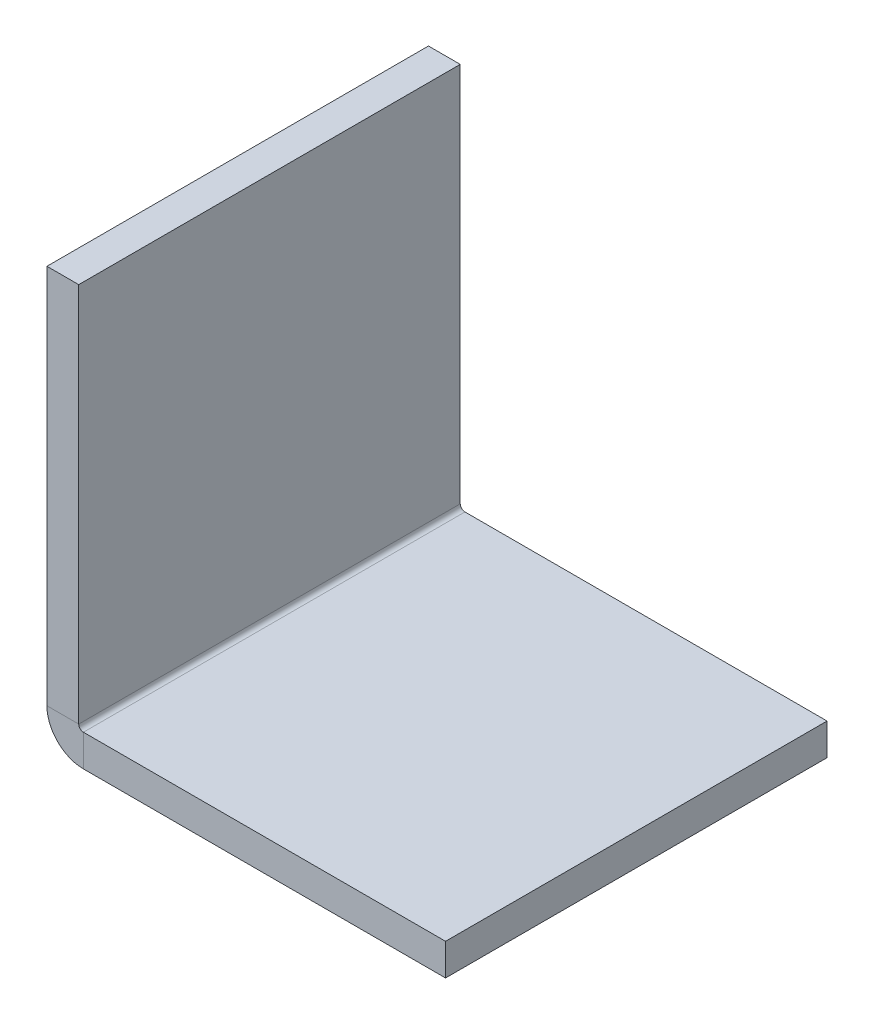
ISO-10303-21;
HEADER;
FILE_DESCRIPTION(('STEP AP214'),'2;1');
FILE_NAME('part.step','',(''),(''),'','','');
FILE_SCHEMA(('AUTOMOTIVE_DESIGN { 1 0 10303 214 1 1 1 1 }'));
ENDSEC;
DATA;
#1=APPLICATION_CONTEXT('core data for automotive mechanical design processes');
#2=APPLICATION_PROTOCOL_DEFINITION('international standard','automotive_design',2000,#1);
#3=PRODUCT_CONTEXT('',#1,'mechanical');
#4=PRODUCT('Part','Part','',(#3));
#5=PRODUCT_RELATED_PRODUCT_CATEGORY('part','',(#4));
#6=PRODUCT_DEFINITION_FORMATION('','',#4);
#7=PRODUCT_DEFINITION_CONTEXT('part definition',#1,'design');
#8=PRODUCT_DEFINITION('design','',#6,#7);
#9=PRODUCT_DEFINITION_SHAPE('','',#8);
#10=(LENGTH_UNIT() NAMED_UNIT(*) SI_UNIT(.MILLI.,.METRE.));
#11=(NAMED_UNIT(*) PLANE_ANGLE_UNIT() SI_UNIT($,.RADIAN.));
#12=(NAMED_UNIT(*) SI_UNIT($,.STERADIAN.) SOLID_ANGLE_UNIT());
#13=UNCERTAINTY_MEASURE_WITH_UNIT(LENGTH_MEASURE(1.E-05),#10,'distance_accuracy_value','');
#14=(GEOMETRIC_REPRESENTATION_CONTEXT(3) GLOBAL_UNCERTAINTY_ASSIGNED_CONTEXT((#13)) GLOBAL_UNIT_ASSIGNED_CONTEXT((#10,
#11,#12)) REPRESENTATION_CONTEXT('',''));
#15=CARTESIAN_POINT('',(0.,0.,0.));
#16=DIRECTION('',(0.,0.,1.));
#17=DIRECTION('',(1.,0.,0.));
#18=AXIS2_PLACEMENT_3D('',#15,#16,#17);
#19=CARTESIAN_POINT('',(-28.1077134113646,-30.2955996207415,30.));
#20=DIRECTION('',(0.,0.,1.));
#21=DIRECTION('',(1.,0.,0.));
#22=AXIS2_PLACEMENT_3D('',#19,#20,#21);
#23=PLANE('',#22);
#24=DIRECTION('',(0.,-1.,0.));
#25=VECTOR('',#24,1.);
#26=CARTESIAN_POINT('',(-28.1077134113646,-30.2955996207415,30.));
#27=LINE('',#26,#25);
#28=CARTESIAN_POINT('',(-28.1077134113646,-30.2955996207415,30.));
#29=VERTEX_POINT('',#28);
#30=CARTESIAN_POINT('',(-28.1077134113646,-35.2955996207415,30.));
#31=VERTEX_POINT('',#30);
#32=EDGE_CURVE('E11',#29,#31,#27,.T.);
#33=ORIENTED_EDGE('',*,*,#32,.F.);
#34=CARTESIAN_POINT('',(-28.1077134113647,-29.5589996207415,30.));
#35=DIRECTION('',(0.,0.,1.));
#36=DIRECTION('',(1.,0.,0.));
#37=AXIS2_PLACEMENT_3D('',#34,#35,#36);
#38=CIRCLE('',#37,0.7366);
#39=CARTESIAN_POINT('',(-28.8443134113647,-29.5589996207415,30.));
#40=VERTEX_POINT('',#39);
#41=EDGE_CURVE('E140',#40,#29,#38,.T.);
#42=ORIENTED_EDGE('',*,*,#41,.F.);
#43=DIRECTION('',(1.,0.,0.));
#44=VECTOR('',#43,1.);
#45=CARTESIAN_POINT('',(-33.8443134113647,-29.5589996207415,30.));
#46=LINE('',#45,#44);
#47=CARTESIAN_POINT('',(-33.8443134113647,-29.5589996207415,30.));
#48=VERTEX_POINT('',#47);
#49=EDGE_CURVE('E51',#48,#40,#46,.T.);
#50=ORIENTED_EDGE('',*,*,#49,.F.);
#51=CARTESIAN_POINT('',(-28.1077134113647,-29.5589996207415,30.));
#52=DIRECTION('',(0.,0.,1.));
#53=DIRECTION('',(1.,0.,0.));
#54=AXIS2_PLACEMENT_3D('',#51,#52,#53);
#55=CIRCLE('',#54,5.7366);
#56=EDGE_CURVE('E133',#48,#31,#55,.T.);
#57=ORIENTED_EDGE('',*,*,#56,.T.);
#58=EDGE_LOOP('',(#33,#42,#50,#57));
#59=FACE_BOUND('',#58,.T.);
#60=ADVANCED_FACE('F43',(#59),#23,.T.);
#61=CARTESIAN_POINT('',(-33.8443134113647,-29.5589996207415,30.));
#62=DIRECTION('',(0.,0.,1.));
#63=DIRECTION('',(1.,0.,0.));
#64=AXIS2_PLACEMENT_3D('',#61,#62,#63);
#65=PLANE('',#64);
#66=DIRECTION('',(1.,0.,0.));
#67=VECTOR('',#66,1.);
#68=CARTESIAN_POINT('',(28.8443134113647,-30.2955996207415,30.));
#69=LINE('',#68,#67);
#70=CARTESIAN_POINT('',(28.8443134113647,-30.2955996207415,30.));
#71=VERTEX_POINT('',#70);
#72=EDGE_CURVE('E189',#29,#71,#69,.T.);
#73=ORIENTED_EDGE('',*,*,#72,.F.);
#74=ORIENTED_EDGE('',*,*,#32,.T.);
#75=DIRECTION('',(1.,0.,0.));
#76=VECTOR('',#75,1.);
#77=CARTESIAN_POINT('',(28.8443134113647,-35.2955996207415,30.));
#78=LINE('',#77,#76);
#79=CARTESIAN_POINT('',(28.8443134113647,-35.2955996207415,30.));
#80=VERTEX_POINT('',#79);
#81=EDGE_CURVE('E99',#31,#80,#78,.T.);
#82=ORIENTED_EDGE('',*,*,#81,.T.);
#83=DIRECTION('',(0.,-1.,0.));
#84=VECTOR('',#83,1.);
#85=CARTESIAN_POINT('',(28.8443134113647,-30.2955996207415,30.));
#86=LINE('',#85,#84);
#87=EDGE_CURVE('E346',#71,#80,#86,.T.);
#88=ORIENTED_EDGE('',*,*,#87,.F.);
#89=EDGE_LOOP('',(#73,#74,#82,#88));
#90=FACE_BOUND('',#89,.T.);
#91=ADVANCED_FACE('F197',(#90),#65,.T.);
#92=CARTESIAN_POINT('',(-28.8443134113647,-29.5589996207415,-30.));
#93=DIRECTION('',(0.,0.,-1.));
#94=DIRECTION('',(-1.,0.,0.));
#95=AXIS2_PLACEMENT_3D('',#92,#93,#94);
#96=PLANE('',#95);
#97=DIRECTION('',(-1.,0.,0.));
#98=VECTOR('',#97,1.);
#99=CARTESIAN_POINT('',(-28.8443134113647,-29.5589996207415,-30.));
#100=LINE('',#99,#98);
#101=CARTESIAN_POINT('',(-28.8443134113647,-29.5589996207415,-30.));
#102=VERTEX_POINT('',#101);
#103=CARTESIAN_POINT('',(-33.8443134113647,-29.5589996207415,-30.));
#104=VERTEX_POINT('',#103);
#105=EDGE_CURVE('E86',#102,#104,#100,.T.);
#106=ORIENTED_EDGE('',*,*,#105,.F.);
#107=CARTESIAN_POINT('',(-28.1077134113647,-29.5589996207415,-30.));
#108=DIRECTION('',(0.,0.,1.));
#109=DIRECTION('',(1.,0.,0.));
#110=AXIS2_PLACEMENT_3D('',#107,#108,#109);
#111=CIRCLE('',#110,0.7366);
#112=CARTESIAN_POINT('',(-28.1077134113646,-30.2955996207415,-30.));
#113=VERTEX_POINT('',#112);
#114=EDGE_CURVE('E155',#102,#113,#111,.T.);
#115=ORIENTED_EDGE('',*,*,#114,.T.);
#116=DIRECTION('',(0.,1.,0.));
#117=VECTOR('',#116,1.);
#118=CARTESIAN_POINT('',(-28.1077134113646,-35.2955996207415,-30.));
#119=LINE('',#118,#117);
#120=CARTESIAN_POINT('',(-28.1077134113646,-35.2955996207415,-30.));
#121=VERTEX_POINT('',#120);
#122=EDGE_CURVE('E93',#121,#113,#119,.T.);
#123=ORIENTED_EDGE('',*,*,#122,.F.);
#124=CARTESIAN_POINT('',(-28.1077134113647,-29.5589996207415,-30.));
#125=DIRECTION('',(0.,0.,1.));
#126=DIRECTION('',(1.,0.,0.));
#127=AXIS2_PLACEMENT_3D('',#124,#125,#126);
#128=CIRCLE('',#127,5.7366);
#129=EDGE_CURVE('E162',#104,#121,#128,.T.);
#130=ORIENTED_EDGE('',*,*,#129,.F.);
#131=EDGE_LOOP('',(#106,#115,#123,#130));
#132=FACE_BOUND('',#131,.T.);
#133=ADVANCED_FACE('F195',(#132),#96,.T.);
#134=CARTESIAN_POINT('',(-28.1077134113646,-35.2955996207415,-30.));
#135=DIRECTION('',(0.,0.,-1.));
#136=DIRECTION('',(-1.,0.,0.));
#137=AXIS2_PLACEMENT_3D('',#134,#135,#136);
#138=PLANE('',#137);
#139=DIRECTION('',(0.,-1.,0.));
#140=VECTOR('',#139,1.);
#141=CARTESIAN_POINT('',(-28.8443134113647,30.2955996207415,-30.));
#142=LINE('',#141,#140);
#143=CARTESIAN_POINT('',(-28.8443134113647,30.2955996207415,-30.));
#144=VERTEX_POINT('',#143);
#145=EDGE_CURVE('E157',#144,#102,#142,.T.);
#146=ORIENTED_EDGE('',*,*,#145,.T.);
#147=ORIENTED_EDGE('',*,*,#105,.T.);
#148=DIRECTION('',(0.,1.,0.));
#149=VECTOR('',#148,1.);
#150=CARTESIAN_POINT('',(-33.8443134113647,30.2955996207415,-30.));
#151=LINE('',#150,#149);
#152=CARTESIAN_POINT('',(-33.8443134113647,30.2955996207415,-30.));
#153=VERTEX_POINT('',#152);
#154=EDGE_CURVE('E160',#153,#104,#151,.F.);
#155=ORIENTED_EDGE('',*,*,#154,.F.);
#156=DIRECTION('',(1.,0.,0.));
#157=VECTOR('',#156,1.);
#158=CARTESIAN_POINT('',(-33.8443134113647,30.2955996207415,-30.));
#159=LINE('',#158,#157);
#160=EDGE_CURVE('E121',#153,#144,#159,.T.);
#161=ORIENTED_EDGE('',*,*,#160,.T.);
#162=EDGE_LOOP('',(#146,#147,#155,#161));
#163=FACE_BOUND('',#162,.T.);
#164=ADVANCED_FACE('F191',(#163),#138,.T.);
#165=CARTESIAN_POINT('',(28.8443134113647,-35.2955996207415,30.));
#166=DIRECTION('',(0.,1.,0.));
#167=DIRECTION('',(0.,0.,1.));
#168=AXIS2_PLACEMENT_3D('',#165,#166,#167);
#169=PLANE('',#168);
#170=DIRECTION('',(1.,0.,0.));
#171=VECTOR('',#170,1.);
#172=CARTESIAN_POINT('',(28.8443134113647,-35.2955996207415,-30.));
#173=LINE('',#172,#171);
#174=CARTESIAN_POINT('',(28.8443134113647,-35.2955996207415,-30.));
#175=VERTEX_POINT('',#174);
#176=EDGE_CURVE('E146',#121,#175,#173,.T.);
#177=ORIENTED_EDGE('',*,*,#176,.T.);
#178=DIRECTION('',(0.,0.,-1.));
#179=VECTOR('',#178,1.);
#180=CARTESIAN_POINT('',(28.8443134113647,-35.2955996207415,30.));
#181=LINE('',#180,#179);
#182=EDGE_CURVE('E176',#80,#175,#181,.T.);
#183=ORIENTED_EDGE('',*,*,#182,.F.);
#184=ORIENTED_EDGE('',*,*,#81,.F.);
#185=DIRECTION('',(0.,0.,-1.));
#186=VECTOR('',#185,1.);
#187=CARTESIAN_POINT('',(-28.1077134113646,-35.2955996207415,30.));
#188=LINE('',#187,#186);
#189=EDGE_CURVE('E145',#31,#121,#188,.T.);
#190=ORIENTED_EDGE('',*,*,#189,.T.);
#191=EDGE_LOOP('',(#177,#183,#184,#190));
#192=FACE_BOUND('',#191,.T.);
#193=ADVANCED_FACE('F203',(#192),#169,.F.);
#194=CARTESIAN_POINT('',(28.8443134113647,-30.2955996207415,30.));
#195=DIRECTION('',(1.,0.,0.));
#196=DIRECTION('',(0.,0.,-1.));
#197=AXIS2_PLACEMENT_3D('',#194,#195,#196);
#198=PLANE('',#197);
#199=DIRECTION('',(0.,-1.,0.));
#200=VECTOR('',#199,1.);
#201=CARTESIAN_POINT('',(28.8443134113647,-30.2955996207415,-30.));
#202=LINE('',#201,#200);
#203=CARTESIAN_POINT('',(28.8443134113647,-30.2955996207415,-30.));
#204=VERTEX_POINT('',#203);
#205=EDGE_CURVE('E149',#204,#175,#202,.T.);
#206=ORIENTED_EDGE('',*,*,#205,.F.);
#207=DIRECTION('',(0.,0.,-1.));
#208=VECTOR('',#207,1.);
#209=CARTESIAN_POINT('',(28.8443134113647,-30.2955996207415,30.));
#210=LINE('',#209,#208);
#211=EDGE_CURVE('E174',#71,#204,#210,.T.);
#212=ORIENTED_EDGE('',*,*,#211,.F.);
#213=ORIENTED_EDGE('',*,*,#87,.T.);
#214=ORIENTED_EDGE('',*,*,#182,.T.);
#215=EDGE_LOOP('',(#206,#212,#213,#214));
#216=FACE_BOUND('',#215,.T.);
#217=ADVANCED_FACE('F236',(#216),#198,.T.);
#218=CARTESIAN_POINT('',(28.8443134113647,-30.2955996207415,30.));
#219=DIRECTION('',(0.,1.,0.));
#220=DIRECTION('',(0.,0.,1.));
#221=AXIS2_PLACEMENT_3D('',#218,#219,#220);
#222=PLANE('',#221);
#223=DIRECTION('',(1.,0.,0.));
#224=VECTOR('',#223,1.);
#225=CARTESIAN_POINT('',(28.8443134113647,-30.2955996207415,-30.));
#226=LINE('',#225,#224);
#227=EDGE_CURVE('E152',#113,#204,#226,.T.);
#228=ORIENTED_EDGE('',*,*,#227,.F.);
#229=DIRECTION('',(0.,0.,-1.));
#230=VECTOR('',#229,1.);
#231=CARTESIAN_POINT('',(-28.1077134113646,-30.2955996207415,30.));
#232=LINE('',#231,#230);
#233=EDGE_CURVE('E171',#29,#113,#232,.T.);
#234=ORIENTED_EDGE('',*,*,#233,.F.);
#235=ORIENTED_EDGE('',*,*,#72,.T.);
#236=ORIENTED_EDGE('',*,*,#211,.T.);
#237=EDGE_LOOP('',(#228,#234,#235,#236));
#238=FACE_BOUND('',#237,.T.);
#239=ADVANCED_FACE('F247',(#238),#222,.T.);
#240=CARTESIAN_POINT('',(-28.1077134113647,-29.5589996207415,30.));
#241=DIRECTION('',(0.,0.,-1.));
#242=DIRECTION('',(-1.,0.,0.));
#243=AXIS2_PLACEMENT_3D('',#240,#241,#242);
#244=CYLINDRICAL_SURFACE('',#243,0.7366);
#245=ORIENTED_EDGE('',*,*,#114,.F.);
#246=DIRECTION('',(0.,0.,-1.));
#247=VECTOR('',#246,1.);
#248=CARTESIAN_POINT('',(-28.8443134113647,-29.5589996207415,30.));
#249=LINE('',#248,#247);
#250=EDGE_CURVE('E168',#40,#102,#249,.T.);
#251=ORIENTED_EDGE('',*,*,#250,.F.);
#252=ORIENTED_EDGE('',*,*,#41,.T.);
#253=ORIENTED_EDGE('',*,*,#233,.T.);
#254=EDGE_LOOP('',(#245,#251,#252,#253));
#255=FACE_BOUND('',#254,.T.);
#256=ADVANCED_FACE('F185',(#255),#244,.F.);
#257=CARTESIAN_POINT('',(-28.8443134113647,30.2955996207415,30.));
#258=DIRECTION('',(1.,0.,0.));
#259=DIRECTION('',(0.,0.,-1.));
#260=AXIS2_PLACEMENT_3D('',#257,#258,#259);
#261=PLANE('',#260);
#262=ORIENTED_EDGE('',*,*,#145,.F.);
#263=DIRECTION('',(0.,0.,-1.));
#264=VECTOR('',#263,1.);
#265=CARTESIAN_POINT('',(-28.8443134113647,30.2955996207415,30.));
#266=LINE('',#265,#264);
#267=CARTESIAN_POINT('',(-28.8443134113647,30.2955996207415,30.));
#268=VERTEX_POINT('',#267);
#269=EDGE_CURVE('E123',#268,#144,#266,.T.);
#270=ORIENTED_EDGE('',*,*,#269,.F.);
#271=DIRECTION('',(0.,-1.,0.));
#272=VECTOR('',#271,1.);
#273=CARTESIAN_POINT('',(-28.8443134113647,30.2955996207415,30.));
#274=LINE('',#273,#272);
#275=EDGE_CURVE('E138',#268,#40,#274,.T.);
#276=ORIENTED_EDGE('',*,*,#275,.T.);
#277=ORIENTED_EDGE('',*,*,#250,.T.);
#278=EDGE_LOOP('',(#262,#270,#276,#277));
#279=FACE_BOUND('',#278,.T.);
#280=ADVANCED_FACE('F190',(#279),#261,.T.);
#281=CARTESIAN_POINT('',(-33.8443134113647,30.2955996207415,30.));
#282=DIRECTION('',(0.,1.,0.));
#283=DIRECTION('',(0.,0.,1.));
#284=AXIS2_PLACEMENT_3D('',#281,#282,#283);
#285=PLANE('',#284);
#286=ORIENTED_EDGE('',*,*,#160,.F.);
#287=DIRECTION('',(0.,0.,-1.));
#288=VECTOR('',#287,1.);
#289=CARTESIAN_POINT('',(-33.8443134113647,30.2955996207415,30.));
#290=LINE('',#289,#288);
#291=CARTESIAN_POINT('',(-33.8443134113647,30.2955996207415,30.));
#292=VERTEX_POINT('',#291);
#293=EDGE_CURVE('E115',#292,#153,#290,.T.);
#294=ORIENTED_EDGE('',*,*,#293,.F.);
#295=DIRECTION('',(1.,0.,0.));
#296=VECTOR('',#295,1.);
#297=CARTESIAN_POINT('',(-33.8443134113647,30.2955996207415,30.));
#298=LINE('',#297,#296);
#299=EDGE_CURVE('E119',#292,#268,#298,.T.);
#300=ORIENTED_EDGE('',*,*,#299,.T.);
#301=ORIENTED_EDGE('',*,*,#269,.T.);
#302=EDGE_LOOP('',(#286,#294,#300,#301));
#303=FACE_BOUND('',#302,.T.);
#304=ADVANCED_FACE('F117',(#303),#285,.T.);
#305=CARTESIAN_POINT('',(-33.8443134113647,30.2955996207415,30.));
#306=DIRECTION('',(1.,0.,0.));
#307=DIRECTION('',(0.,0.,-1.));
#308=AXIS2_PLACEMENT_3D('',#305,#306,#307);
#309=PLANE('',#308);
#310=ORIENTED_EDGE('',*,*,#154,.T.);
#311=DIRECTION('',(0.,0.,-1.));
#312=VECTOR('',#311,1.);
#313=CARTESIAN_POINT('',(-33.8443134113647,-29.5589996207415,30.));
#314=LINE('',#313,#312);
#315=EDGE_CURVE('E124',#48,#104,#314,.T.);
#316=ORIENTED_EDGE('',*,*,#315,.F.);
#317=DIRECTION('',(0.,1.,0.));
#318=VECTOR('',#317,1.);
#319=CARTESIAN_POINT('',(-33.8443134113647,30.2955996207415,30.));
#320=LINE('',#319,#318);
#321=EDGE_CURVE('E128',#292,#48,#320,.F.);
#322=ORIENTED_EDGE('',*,*,#321,.F.);
#323=ORIENTED_EDGE('',*,*,#293,.T.);
#324=EDGE_LOOP('',(#310,#316,#322,#323));
#325=FACE_BOUND('',#324,.T.);
#326=ADVANCED_FACE('F129',(#325),#309,.F.);
#327=CARTESIAN_POINT('',(-28.1077134113647,-29.5589996207415,30.));
#328=DIRECTION('',(0.,0.,-1.));
#329=DIRECTION('',(-1.,0.,0.));
#330=AXIS2_PLACEMENT_3D('',#327,#328,#329);
#331=CYLINDRICAL_SURFACE('',#330,5.7366);
#332=ORIENTED_EDGE('',*,*,#129,.T.);
#333=ORIENTED_EDGE('',*,*,#189,.F.);
#334=ORIENTED_EDGE('',*,*,#56,.F.);
#335=ORIENTED_EDGE('',*,*,#315,.T.);
#336=EDGE_LOOP('',(#332,#333,#334,#335));
#337=FACE_BOUND('',#336,.T.);
#338=ADVANCED_FACE('F193',(#337),#331,.T.);
#339=CARTESIAN_POINT('',(-28.1077134113647,-29.5589996207415,30.));
#340=DIRECTION('',(0.,0.,1.));
#341=DIRECTION('',(1.,0.,0.));
#342=AXIS2_PLACEMENT_3D('',#339,#340,#341);
#343=PLANE('',#342);
#344=ORIENTED_EDGE('',*,*,#321,.T.);
#345=ORIENTED_EDGE('',*,*,#49,.T.);
#346=ORIENTED_EDGE('',*,*,#275,.F.);
#347=ORIENTED_EDGE('',*,*,#299,.F.);
#348=EDGE_LOOP('',(#344,#345,#346,#347));
#349=FACE_BOUND('',#348,.T.);
#350=ADVANCED_FACE('F136',(#349),#343,.T.);
#351=CARTESIAN_POINT('',(-28.1077134113647,-29.5589996207415,-30.));
#352=DIRECTION('',(0.,0.,1.));
#353=DIRECTION('',(1.,0.,0.));
#354=AXIS2_PLACEMENT_3D('',#351,#352,#353);
#355=PLANE('',#354);
#356=ORIENTED_EDGE('',*,*,#176,.F.);
#357=ORIENTED_EDGE('',*,*,#122,.T.);
#358=ORIENTED_EDGE('',*,*,#227,.T.);
#359=ORIENTED_EDGE('',*,*,#205,.T.);
#360=EDGE_LOOP('',(#356,#357,#358,#359));
#361=FACE_BOUND('',#360,.T.);
#362=ADVANCED_FACE('F313',(#361),#355,.F.);
#363=CLOSED_SHELL('',(#60,#91,#133,#164,#193,#217,#239,#256,#280,#304,#326,#338,#350,#362));
#364=MANIFOLD_SOLID_BREP('B2',#363);
#365=ADVANCED_BREP_SHAPE_REPRESENTATION('',(#18,#364),#14);
#366=SHAPE_DEFINITION_REPRESENTATION(#9,#365);
ENDSEC;
END-ISO-10303-21;
